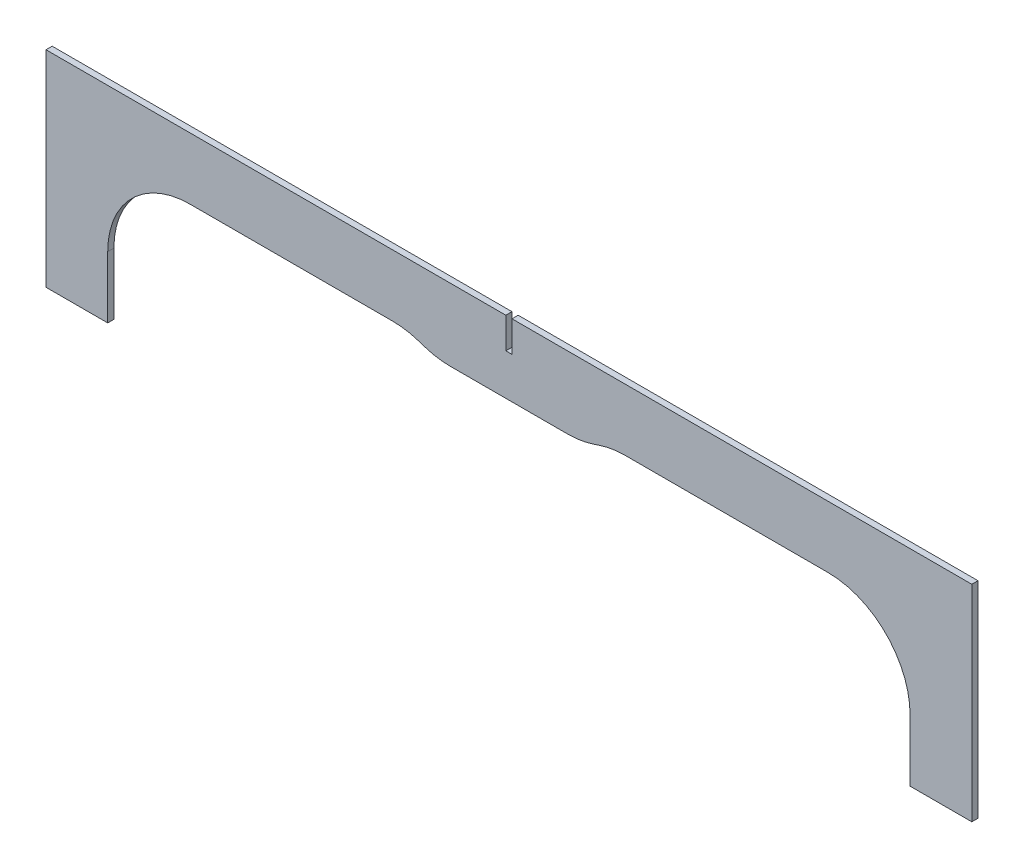
ISO-10303-21;
HEADER;
FILE_DESCRIPTION(('STEP AP214'),'2;1');
FILE_NAME('part.step','',(''),(''),'','','');
FILE_SCHEMA(('AUTOMOTIVE_DESIGN { 1 0 10303 214 1 1 1 1 }'));
ENDSEC;
DATA;
#1=APPLICATION_CONTEXT('core data for automotive mechanical design processes');
#2=APPLICATION_PROTOCOL_DEFINITION('international standard','automotive_design',2000,#1);
#3=PRODUCT_CONTEXT('',#1,'mechanical');
#4=PRODUCT('Part','Part','',(#3));
#5=PRODUCT_RELATED_PRODUCT_CATEGORY('part','',(#4));
#6=PRODUCT_DEFINITION_FORMATION('','',#4);
#7=PRODUCT_DEFINITION_CONTEXT('part definition',#1,'design');
#8=PRODUCT_DEFINITION('design','',#6,#7);
#9=PRODUCT_DEFINITION_SHAPE('','',#8);
#10=(LENGTH_UNIT() NAMED_UNIT(*) SI_UNIT(.MILLI.,.METRE.));
#11=(NAMED_UNIT(*) PLANE_ANGLE_UNIT() SI_UNIT($,.RADIAN.));
#12=(NAMED_UNIT(*) SI_UNIT($,.STERADIAN.) SOLID_ANGLE_UNIT());
#13=UNCERTAINTY_MEASURE_WITH_UNIT(LENGTH_MEASURE(1.E-05),#10,'distance_accuracy_value','');
#14=(GEOMETRIC_REPRESENTATION_CONTEXT(3) GLOBAL_UNCERTAINTY_ASSIGNED_CONTEXT((#13)) GLOBAL_UNIT_ASSIGNED_CONTEXT((#10,
#11,#12)) REPRESENTATION_CONTEXT('',''));
#15=CARTESIAN_POINT('',(0.,0.,0.));
#16=DIRECTION('',(0.,0.,1.));
#17=DIRECTION('',(1.,0.,0.));
#18=AXIS2_PLACEMENT_3D('',#15,#16,#17);
#19=CARTESIAN_POINT('',(30.,0.,3.));
#20=DIRECTION('',(0.,1.,0.));
#21=DIRECTION('',(-1.,0.,0.));
#22=AXIS2_PLACEMENT_3D('',#19,#20,#21);
#23=PLANE('',#22);
#24=DIRECTION('',(1.,0.,0.));
#25=VECTOR('',#24,1.);
#26=CARTESIAN_POINT('',(30.,0.,0.));
#27=LINE('',#26,#25);
#28=CARTESIAN_POINT('',(0.,0.,0.));
#29=VERTEX_POINT('',#28);
#30=CARTESIAN_POINT('',(30.,0.,0.));
#31=VERTEX_POINT('',#30);
#32=EDGE_CURVE('E211',#29,#31,#27,.T.);
#33=ORIENTED_EDGE('',*,*,#32,.T.);
#34=DIRECTION('',(0.,0.,-1.));
#35=VECTOR('',#34,1.);
#36=CARTESIAN_POINT('',(30.,0.,3.));
#37=LINE('',#36,#35);
#38=CARTESIAN_POINT('',(30.,0.,3.));
#39=VERTEX_POINT('',#38);
#40=EDGE_CURVE('E192',#39,#31,#37,.T.);
#41=ORIENTED_EDGE('',*,*,#40,.F.);
#42=DIRECTION('',(1.,0.,0.));
#43=VECTOR('',#42,1.);
#44=CARTESIAN_POINT('',(30.,0.,3.));
#45=LINE('',#44,#43);
#46=CARTESIAN_POINT('',(0.,0.,3.));
#47=VERTEX_POINT('',#46);
#48=EDGE_CURVE('E198',#47,#39,#45,.T.);
#49=ORIENTED_EDGE('',*,*,#48,.F.);
#50=DIRECTION('',(0.,0.,-1.));
#51=VECTOR('',#50,1.);
#52=CARTESIAN_POINT('',(0.,0.,3.));
#53=LINE('',#52,#51);
#54=EDGE_CURVE('E310',#47,#29,#53,.T.);
#55=ORIENTED_EDGE('',*,*,#54,.T.);
#56=EDGE_LOOP('',(#33,#41,#49,#55));
#57=FACE_BOUND('',#56,.T.);
#58=ADVANCED_FACE('F37',(#57),#23,.F.);
#59=CARTESIAN_POINT('',(30.,70.,3.));
#60=DIRECTION('',(-1.,0.,0.));
#61=DIRECTION('',(0.,-1.,0.));
#62=AXIS2_PLACEMENT_3D('',#59,#60,#61);
#63=PLANE('',#62);
#64=DIRECTION('',(0.,1.,0.));
#65=VECTOR('',#64,1.);
#66=CARTESIAN_POINT('',(30.,70.,0.));
#67=LINE('',#66,#65);
#68=CARTESIAN_POINT('',(30.,30.,0.));
#69=VERTEX_POINT('',#68);
#70=EDGE_CURVE('E269',#31,#69,#67,.T.);
#71=ORIENTED_EDGE('',*,*,#70,.T.);
#72=DIRECTION('',(0.,0.,-1.));
#73=VECTOR('',#72,1.);
#74=CARTESIAN_POINT('',(30.,30.,3.));
#75=LINE('',#74,#73);
#76=CARTESIAN_POINT('',(30.,30.,3.));
#77=VERTEX_POINT('',#76);
#78=EDGE_CURVE('E195',#69,#77,#75,.F.);
#79=ORIENTED_EDGE('',*,*,#78,.T.);
#80=DIRECTION('',(0.,1.,0.));
#81=VECTOR('',#80,1.);
#82=CARTESIAN_POINT('',(30.,70.,3.));
#83=LINE('',#82,#81);
#84=EDGE_CURVE('E187',#39,#77,#83,.T.);
#85=ORIENTED_EDGE('',*,*,#84,.F.);
#86=ORIENTED_EDGE('',*,*,#40,.T.);
#87=EDGE_LOOP('',(#71,#79,#85,#86));
#88=FACE_BOUND('',#87,.T.);
#89=ADVANCED_FACE('F190',(#88),#63,.F.);
#90=CARTESIAN_POINT('',(175.,70.,3.));
#91=DIRECTION('',(0.,1.,0.));
#92=DIRECTION('',(-1.,0.,0.));
#93=AXIS2_PLACEMENT_3D('',#90,#91,#92);
#94=PLANE('',#93);
#95=DIRECTION('',(1.,0.,0.));
#96=VECTOR('',#95,1.);
#97=CARTESIAN_POINT('',(175.,70.,0.));
#98=LINE('',#97,#96);
#99=CARTESIAN_POINT('',(70.,70.,0.));
#100=VERTEX_POINT('',#99);
#101=CARTESIAN_POINT('',(168.508893593265,70.,0.));
#102=VERTEX_POINT('',#101);
#103=EDGE_CURVE('E271',#100,#102,#98,.T.);
#104=ORIENTED_EDGE('',*,*,#103,.T.);
#105=DIRECTION('',(0.,0.,-1.));
#106=VECTOR('',#105,1.);
#107=CARTESIAN_POINT('',(168.508893593265,70.,3.));
#108=LINE('',#107,#106);
#109=CARTESIAN_POINT('',(168.508893593265,70.,3.));
#110=VERTEX_POINT('',#109);
#111=EDGE_CURVE('E240',#102,#110,#108,.F.);
#112=ORIENTED_EDGE('',*,*,#111,.T.);
#113=DIRECTION('',(1.,0.,0.));
#114=VECTOR('',#113,1.);
#115=CARTESIAN_POINT('',(175.,70.,3.));
#116=LINE('',#115,#114);
#117=CARTESIAN_POINT('',(70.,70.,3.));
#118=VERTEX_POINT('',#117);
#119=EDGE_CURVE('E197',#118,#110,#116,.T.);
#120=ORIENTED_EDGE('',*,*,#119,.F.);
#121=DIRECTION('',(0.,0.,-1.));
#122=VECTOR('',#121,1.);
#123=CARTESIAN_POINT('',(70.,70.,0.));
#124=LINE('',#123,#122);
#125=EDGE_CURVE('E237',#118,#100,#124,.T.);
#126=ORIENTED_EDGE('',*,*,#125,.T.);
#127=EDGE_LOOP('',(#104,#112,#120,#126));
#128=FACE_BOUND('',#127,.T.);
#129=ADVANCED_FACE('F279',(#128),#94,.F.);
#130=CARTESIAN_POINT('',(190.,65.,3.));
#131=DIRECTION('',(0.316227766016839,0.948683298050514,0.));
#132=DIRECTION('',(-0.948683298050514,0.316227766016839,0.));
#133=AXIS2_PLACEMENT_3D('',#130,#131,#132);
#134=PLANE('',#133);
#135=DIRECTION('',(0.948683298050513,-0.316227766016839,0.));
#136=VECTOR('',#135,1.);
#137=CARTESIAN_POINT('',(190.,65.,0.));
#138=LINE('',#137,#136);
#139=CARTESIAN_POINT('',(181.158004233938,67.9473319220205,0.));
#140=VERTEX_POINT('',#139);
#141=CARTESIAN_POINT('',(183.841995766062,67.0526680779794,0.));
#142=VERTEX_POINT('',#141);
#143=EDGE_CURVE('E313',#140,#142,#138,.T.);
#144=ORIENTED_EDGE('',*,*,#143,.T.);
#145=DIRECTION('',(0.,0.,-1.));
#146=VECTOR('',#145,1.);
#147=CARTESIAN_POINT('',(183.841995766062,67.0526680779794,3.));
#148=LINE('',#147,#146);
#149=CARTESIAN_POINT('',(183.841995766062,67.0526680779794,3.));
#150=VERTEX_POINT('',#149);
#151=EDGE_CURVE('E231',#142,#150,#148,.F.);
#152=ORIENTED_EDGE('',*,*,#151,.T.);
#153=DIRECTION('',(0.948683298050513,-0.316227766016839,0.));
#154=VECTOR('',#153,1.);
#155=CARTESIAN_POINT('',(190.,65.,3.));
#156=LINE('',#155,#154);
#157=CARTESIAN_POINT('',(181.158004233938,67.9473319220205,3.));
#158=VERTEX_POINT('',#157);
#159=EDGE_CURVE('E281',#158,#150,#156,.T.);
#160=ORIENTED_EDGE('',*,*,#159,.F.);
#161=DIRECTION('',(0.,0.,-1.));
#162=VECTOR('',#161,1.);
#163=CARTESIAN_POINT('',(181.158004233938,67.9473319220205,0.));
#164=LINE('',#163,#162);
#165=EDGE_CURVE('E228',#158,#140,#164,.T.);
#166=ORIENTED_EDGE('',*,*,#165,.T.);
#167=EDGE_LOOP('',(#144,#152,#160,#166));
#168=FACE_BOUND('',#167,.T.);
#169=ADVANCED_FACE('F440',(#168),#134,.F.);
#170=CARTESIAN_POINT('',(260.,65.,3.));
#171=DIRECTION('',(0.,1.,0.));
#172=DIRECTION('',(-1.,0.,0.));
#173=AXIS2_PLACEMENT_3D('',#170,#171,#172);
#174=PLANE('',#173);
#175=DIRECTION('',(1.,0.,0.));
#176=VECTOR('',#175,1.);
#177=CARTESIAN_POINT('',(260.,65.,3.));
#178=LINE('',#177,#176);
#179=CARTESIAN_POINT('',(196.491106406735,65.,3.));
#180=VERTEX_POINT('',#179);
#181=CARTESIAN_POINT('',(253.508893593265,65.,3.));
#182=VERTEX_POINT('',#181);
#183=EDGE_CURVE('E283',#180,#182,#178,.T.);
#184=ORIENTED_EDGE('',*,*,#183,.F.);
#185=DIRECTION('',(0.,0.,-1.));
#186=VECTOR('',#185,1.);
#187=CARTESIAN_POINT('',(196.491106406735,65.,3.));
#188=LINE('',#187,#186);
#189=CARTESIAN_POINT('',(196.491106406735,65.,0.));
#190=VERTEX_POINT('',#189);
#191=EDGE_CURVE('E215',#180,#190,#188,.T.);
#192=ORIENTED_EDGE('',*,*,#191,.T.);
#193=DIRECTION('',(1.,0.,0.));
#194=VECTOR('',#193,1.);
#195=CARTESIAN_POINT('',(260.,65.,0.));
#196=LINE('',#195,#194);
#197=CARTESIAN_POINT('',(253.508893593265,65.,0.));
#198=VERTEX_POINT('',#197);
#199=EDGE_CURVE('E316',#190,#198,#196,.T.);
#200=ORIENTED_EDGE('',*,*,#199,.T.);
#201=DIRECTION('',(0.,0.,-1.));
#202=VECTOR('',#201,1.);
#203=CARTESIAN_POINT('',(253.508893593265,65.,3.));
#204=LINE('',#203,#202);
#205=EDGE_CURVE('E212',#198,#182,#204,.F.);
#206=ORIENTED_EDGE('',*,*,#205,.T.);
#207=EDGE_LOOP('',(#184,#192,#200,#206));
#208=FACE_BOUND('',#207,.T.);
#209=ADVANCED_FACE('F434',(#208),#174,.F.);
#210=CARTESIAN_POINT('',(275.,70.,3.));
#211=DIRECTION('',(-0.316227766016835,0.948683298050515,0.));
#212=DIRECTION('',(-0.948683298050515,-0.316227766016835,0.));
#213=AXIS2_PLACEMENT_3D('',#210,#211,#212);
#214=PLANE('',#213);
#215=DIRECTION('',(0.948683298050515,0.316227766016835,0.));
#216=VECTOR('',#215,1.);
#217=CARTESIAN_POINT('',(275.,70.,3.));
#218=LINE('',#217,#216);
#219=CARTESIAN_POINT('',(266.158004233938,67.0526680779794,3.));
#220=VERTEX_POINT('',#219);
#221=CARTESIAN_POINT('',(268.841995766062,67.9473319220206,3.));
#222=VERTEX_POINT('',#221);
#223=EDGE_CURVE('E288',#220,#222,#218,.T.);
#224=ORIENTED_EDGE('',*,*,#223,.F.);
#225=DIRECTION('',(0.,0.,-1.));
#226=VECTOR('',#225,1.);
#227=CARTESIAN_POINT('',(266.158004233938,67.0526680779794,3.));
#228=LINE('',#227,#226);
#229=CARTESIAN_POINT('',(266.158004233938,67.0526680779794,0.));
#230=VERTEX_POINT('',#229);
#231=EDGE_CURVE('E244',#220,#230,#228,.T.);
#232=ORIENTED_EDGE('',*,*,#231,.T.);
#233=DIRECTION('',(0.948683298050515,0.316227766016835,0.));
#234=VECTOR('',#233,1.);
#235=CARTESIAN_POINT('',(275.,70.,0.));
#236=LINE('',#235,#234);
#237=CARTESIAN_POINT('',(268.841995766062,67.9473319220206,0.));
#238=VERTEX_POINT('',#237);
#239=EDGE_CURVE('E319',#230,#238,#236,.T.);
#240=ORIENTED_EDGE('',*,*,#239,.T.);
#241=DIRECTION('',(0.,0.,-1.));
#242=VECTOR('',#241,1.);
#243=CARTESIAN_POINT('',(268.841995766062,67.9473319220206,3.));
#244=LINE('',#243,#242);
#245=EDGE_CURVE('E242',#238,#222,#244,.F.);
#246=ORIENTED_EDGE('',*,*,#245,.T.);
#247=EDGE_LOOP('',(#224,#232,#240,#246));
#248=FACE_BOUND('',#247,.T.);
#249=ADVANCED_FACE('F430',(#248),#214,.F.);
#250=CARTESIAN_POINT('',(420.,70.,3.));
#251=DIRECTION('',(0.,1.,0.));
#252=DIRECTION('',(-1.,0.,0.));
#253=AXIS2_PLACEMENT_3D('',#250,#251,#252);
#254=PLANE('',#253);
#255=DIRECTION('',(1.,0.,0.));
#256=VECTOR('',#255,1.);
#257=CARTESIAN_POINT('',(420.,70.,3.));
#258=LINE('',#257,#256);
#259=CARTESIAN_POINT('',(281.491106406735,70.,3.));
#260=VERTEX_POINT('',#259);
#261=CARTESIAN_POINT('',(380.,70.,3.));
#262=VERTEX_POINT('',#261);
#263=EDGE_CURVE('E291',#260,#262,#258,.T.);
#264=ORIENTED_EDGE('',*,*,#263,.F.);
#265=DIRECTION('',(0.,0.,-1.));
#266=VECTOR('',#265,1.);
#267=CARTESIAN_POINT('',(281.491106406735,70.,0.));
#268=LINE('',#267,#266);
#269=CARTESIAN_POINT('',(281.491106406735,70.,0.));
#270=VERTEX_POINT('',#269);
#271=EDGE_CURVE('E248',#260,#270,#268,.T.);
#272=ORIENTED_EDGE('',*,*,#271,.T.);
#273=DIRECTION('',(1.,0.,0.));
#274=VECTOR('',#273,1.);
#275=CARTESIAN_POINT('',(420.,70.,0.));
#276=LINE('',#275,#274);
#277=CARTESIAN_POINT('',(380.,70.,0.));
#278=VERTEX_POINT('',#277);
#279=EDGE_CURVE('E322',#270,#278,#276,.T.);
#280=ORIENTED_EDGE('',*,*,#279,.T.);
#281=DIRECTION('',(0.,0.,-1.));
#282=VECTOR('',#281,1.);
#283=CARTESIAN_POINT('',(380.,70.,3.));
#284=LINE('',#283,#282);
#285=EDGE_CURVE('E60',#278,#262,#284,.F.);
#286=ORIENTED_EDGE('',*,*,#285,.T.);
#287=EDGE_LOOP('',(#264,#272,#280,#286));
#288=FACE_BOUND('',#287,.T.);
#289=ADVANCED_FACE('F390',(#288),#254,.F.);
#290=CARTESIAN_POINT('',(420.,0.,3.));
#291=DIRECTION('',(1.,0.,0.));
#292=DIRECTION('',(0.,0.,-1.));
#293=AXIS2_PLACEMENT_3D('',#290,#291,#292);
#294=PLANE('',#293);
#295=DIRECTION('',(0.,-1.,0.));
#296=VECTOR('',#295,1.);
#297=CARTESIAN_POINT('',(420.,0.,3.));
#298=LINE('',#297,#296);
#299=CARTESIAN_POINT('',(420.,30.,3.));
#300=VERTEX_POINT('',#299);
#301=CARTESIAN_POINT('',(420.,0.,3.));
#302=VERTEX_POINT('',#301);
#303=EDGE_CURVE('E293',#300,#302,#298,.T.);
#304=ORIENTED_EDGE('',*,*,#303,.F.);
#305=DIRECTION('',(0.,0.,-1.));
#306=VECTOR('',#305,1.);
#307=CARTESIAN_POINT('',(420.,30.,0.));
#308=LINE('',#307,#306);
#309=CARTESIAN_POINT('',(420.,30.,0.));
#310=VERTEX_POINT('',#309);
#311=EDGE_CURVE('E251',#300,#310,#308,.T.);
#312=ORIENTED_EDGE('',*,*,#311,.T.);
#313=DIRECTION('',(0.,-1.,0.));
#314=VECTOR('',#313,1.);
#315=CARTESIAN_POINT('',(420.,0.,0.));
#316=LINE('',#315,#314);
#317=CARTESIAN_POINT('',(420.,0.,0.));
#318=VERTEX_POINT('',#317);
#319=EDGE_CURVE('E324',#310,#318,#316,.T.);
#320=ORIENTED_EDGE('',*,*,#319,.T.);
#321=DIRECTION('',(0.,0.,-1.));
#322=VECTOR('',#321,1.);
#323=CARTESIAN_POINT('',(420.,0.,3.));
#324=LINE('',#323,#322);
#325=EDGE_CURVE('E213',#302,#318,#324,.T.);
#326=ORIENTED_EDGE('',*,*,#325,.F.);
#327=EDGE_LOOP('',(#304,#312,#320,#326));
#328=FACE_BOUND('',#327,.T.);
#329=ADVANCED_FACE('F386',(#328),#294,.F.);
#330=CARTESIAN_POINT('',(450.,0.,3.));
#331=DIRECTION('',(0.,1.,0.));
#332=DIRECTION('',(-1.,0.,0.));
#333=AXIS2_PLACEMENT_3D('',#330,#331,#332);
#334=PLANE('',#333);
#335=DIRECTION('',(1.,0.,0.));
#336=VECTOR('',#335,1.);
#337=CARTESIAN_POINT('',(450.,0.,0.));
#338=LINE('',#337,#336);
#339=CARTESIAN_POINT('',(450.,0.,0.));
#340=VERTEX_POINT('',#339);
#341=EDGE_CURVE('E326',#318,#340,#338,.T.);
#342=ORIENTED_EDGE('',*,*,#341,.T.);
#343=DIRECTION('',(0.,0.,-1.));
#344=VECTOR('',#343,1.);
#345=CARTESIAN_POINT('',(450.,0.,3.));
#346=LINE('',#345,#344);
#347=CARTESIAN_POINT('',(450.,0.,3.));
#348=VERTEX_POINT('',#347);
#349=EDGE_CURVE('E218',#348,#340,#346,.T.);
#350=ORIENTED_EDGE('',*,*,#349,.F.);
#351=DIRECTION('',(1.,0.,0.));
#352=VECTOR('',#351,1.);
#353=CARTESIAN_POINT('',(450.,0.,3.));
#354=LINE('',#353,#352);
#355=EDGE_CURVE('E295',#302,#348,#354,.T.);
#356=ORIENTED_EDGE('',*,*,#355,.F.);
#357=ORIENTED_EDGE('',*,*,#325,.T.);
#358=EDGE_LOOP('',(#342,#350,#356,#357));
#359=FACE_BOUND('',#358,.T.);
#360=ADVANCED_FACE('F384',(#359),#334,.F.);
#361=CARTESIAN_POINT('',(450.,100.,3.));
#362=DIRECTION('',(-1.,0.,0.));
#363=DIRECTION('',(0.,0.,1.));
#364=AXIS2_PLACEMENT_3D('',#361,#362,#363);
#365=PLANE('',#364);
#366=DIRECTION('',(0.,1.,0.));
#367=VECTOR('',#366,1.);
#368=CARTESIAN_POINT('',(450.,100.,0.));
#369=LINE('',#368,#367);
#370=CARTESIAN_POINT('',(450.,100.,0.));
#371=VERTEX_POINT('',#370);
#372=EDGE_CURVE('E328',#340,#371,#369,.T.);
#373=ORIENTED_EDGE('',*,*,#372,.T.);
#374=DIRECTION('',(0.,0.,-1.));
#375=VECTOR('',#374,1.);
#376=CARTESIAN_POINT('',(450.,100.,3.));
#377=LINE('',#376,#375);
#378=CARTESIAN_POINT('',(450.,100.,3.));
#379=VERTEX_POINT('',#378);
#380=EDGE_CURVE('E357',#379,#371,#377,.T.);
#381=ORIENTED_EDGE('',*,*,#380,.F.);
#382=DIRECTION('',(0.,1.,0.));
#383=VECTOR('',#382,1.);
#384=CARTESIAN_POINT('',(450.,100.,3.));
#385=LINE('',#384,#383);
#386=EDGE_CURVE('E297',#348,#379,#385,.T.);
#387=ORIENTED_EDGE('',*,*,#386,.F.);
#388=ORIENTED_EDGE('',*,*,#349,.T.);
#389=EDGE_LOOP('',(#373,#381,#387,#388));
#390=FACE_BOUND('',#389,.T.);
#391=ADVANCED_FACE('F364',(#390),#365,.F.);
#392=CARTESIAN_POINT('',(226.5,100.,3.));
#393=DIRECTION('',(0.,-1.,0.));
#394=DIRECTION('',(0.,0.,-1.));
#395=AXIS2_PLACEMENT_3D('',#392,#393,#394);
#396=PLANE('',#395);
#397=DIRECTION('',(-1.,0.,0.));
#398=VECTOR('',#397,1.);
#399=CARTESIAN_POINT('',(226.5,100.,0.));
#400=LINE('',#399,#398);
#401=CARTESIAN_POINT('',(226.5,100.,0.));
#402=VERTEX_POINT('',#401);
#403=EDGE_CURVE('E330',#371,#402,#400,.T.);
#404=ORIENTED_EDGE('',*,*,#403,.T.);
#405=DIRECTION('',(0.,0.,-1.));
#406=VECTOR('',#405,1.);
#407=CARTESIAN_POINT('',(226.5,100.,3.));
#408=LINE('',#407,#406);
#409=CARTESIAN_POINT('',(226.5,100.,3.));
#410=VERTEX_POINT('',#409);
#411=EDGE_CURVE('E354',#410,#402,#408,.T.);
#412=ORIENTED_EDGE('',*,*,#411,.F.);
#413=DIRECTION('',(-1.,0.,0.));
#414=VECTOR('',#413,1.);
#415=CARTESIAN_POINT('',(226.5,100.,3.));
#416=LINE('',#415,#414);
#417=EDGE_CURVE('E299',#379,#410,#416,.T.);
#418=ORIENTED_EDGE('',*,*,#417,.F.);
#419=ORIENTED_EDGE('',*,*,#380,.T.);
#420=EDGE_LOOP('',(#404,#412,#418,#419));
#421=FACE_BOUND('',#420,.T.);
#422=ADVANCED_FACE('F375',(#421),#396,.F.);
#423=CARTESIAN_POINT('',(226.5,85.,3.));
#424=DIRECTION('',(1.,0.,0.));
#425=DIRECTION('',(0.,0.,-1.));
#426=AXIS2_PLACEMENT_3D('',#423,#424,#425);
#427=PLANE('',#426);
#428=DIRECTION('',(0.,-1.,0.));
#429=VECTOR('',#428,1.);
#430=CARTESIAN_POINT('',(226.5,85.,0.));
#431=LINE('',#430,#429);
#432=CARTESIAN_POINT('',(226.5,85.,0.));
#433=VERTEX_POINT('',#432);
#434=EDGE_CURVE('E332',#402,#433,#431,.T.);
#435=ORIENTED_EDGE('',*,*,#434,.T.);
#436=DIRECTION('',(0.,0.,-1.));
#437=VECTOR('',#436,1.);
#438=CARTESIAN_POINT('',(226.5,85.,3.));
#439=LINE('',#438,#437);
#440=CARTESIAN_POINT('',(226.5,85.,3.));
#441=VERTEX_POINT('',#440);
#442=EDGE_CURVE('E351',#441,#433,#439,.T.);
#443=ORIENTED_EDGE('',*,*,#442,.F.);
#444=DIRECTION('',(0.,-1.,0.));
#445=VECTOR('',#444,1.);
#446=CARTESIAN_POINT('',(226.5,85.,3.));
#447=LINE('',#446,#445);
#448=EDGE_CURVE('E301',#410,#441,#447,.T.);
#449=ORIENTED_EDGE('',*,*,#448,.F.);
#450=ORIENTED_EDGE('',*,*,#411,.T.);
#451=EDGE_LOOP('',(#435,#443,#449,#450));
#452=FACE_BOUND('',#451,.T.);
#453=ADVANCED_FACE('F379',(#452),#427,.F.);
#454=CARTESIAN_POINT('',(223.5,85.,3.));
#455=DIRECTION('',(0.,-1.,0.));
#456=DIRECTION('',(0.,0.,-1.));
#457=AXIS2_PLACEMENT_3D('',#454,#455,#456);
#458=PLANE('',#457);
#459=DIRECTION('',(-1.,0.,0.));
#460=VECTOR('',#459,1.);
#461=CARTESIAN_POINT('',(223.5,85.,0.));
#462=LINE('',#461,#460);
#463=CARTESIAN_POINT('',(223.5,85.,0.));
#464=VERTEX_POINT('',#463);
#465=EDGE_CURVE('E334',#433,#464,#462,.T.);
#466=ORIENTED_EDGE('',*,*,#465,.T.);
#467=DIRECTION('',(0.,0.,-1.));
#468=VECTOR('',#467,1.);
#469=CARTESIAN_POINT('',(223.5,85.,3.));
#470=LINE('',#469,#468);
#471=CARTESIAN_POINT('',(223.5,85.,3.));
#472=VERTEX_POINT('',#471);
#473=EDGE_CURVE('E348',#472,#464,#470,.T.);
#474=ORIENTED_EDGE('',*,*,#473,.F.);
#475=DIRECTION('',(-1.,0.,0.));
#476=VECTOR('',#475,1.);
#477=CARTESIAN_POINT('',(223.5,85.,3.));
#478=LINE('',#477,#476);
#479=EDGE_CURVE('E303',#441,#472,#478,.T.);
#480=ORIENTED_EDGE('',*,*,#479,.F.);
#481=ORIENTED_EDGE('',*,*,#442,.T.);
#482=EDGE_LOOP('',(#466,#474,#480,#481));
#483=FACE_BOUND('',#482,.T.);
#484=ADVANCED_FACE('F465',(#483),#458,.F.);
#485=CARTESIAN_POINT('',(223.5,100.,3.));
#486=DIRECTION('',(-1.,0.,0.));
#487=DIRECTION('',(0.,0.,1.));
#488=AXIS2_PLACEMENT_3D('',#485,#486,#487);
#489=PLANE('',#488);
#490=DIRECTION('',(0.,1.,0.));
#491=VECTOR('',#490,1.);
#492=CARTESIAN_POINT('',(223.5,100.,0.));
#493=LINE('',#492,#491);
#494=CARTESIAN_POINT('',(223.5,100.,0.));
#495=VERTEX_POINT('',#494);
#496=EDGE_CURVE('E336',#464,#495,#493,.T.);
#497=ORIENTED_EDGE('',*,*,#496,.T.);
#498=DIRECTION('',(0.,0.,-1.));
#499=VECTOR('',#498,1.);
#500=CARTESIAN_POINT('',(223.5,100.,3.));
#501=LINE('',#500,#499);
#502=CARTESIAN_POINT('',(223.5,100.,3.));
#503=VERTEX_POINT('',#502);
#504=EDGE_CURVE('E345',#503,#495,#501,.T.);
#505=ORIENTED_EDGE('',*,*,#504,.F.);
#506=DIRECTION('',(0.,1.,0.));
#507=VECTOR('',#506,1.);
#508=CARTESIAN_POINT('',(223.5,100.,3.));
#509=LINE('',#508,#507);
#510=EDGE_CURVE('E305',#472,#503,#509,.T.);
#511=ORIENTED_EDGE('',*,*,#510,.F.);
#512=ORIENTED_EDGE('',*,*,#473,.T.);
#513=EDGE_LOOP('',(#497,#505,#511,#512));
#514=FACE_BOUND('',#513,.T.);
#515=ADVANCED_FACE('F468',(#514),#489,.F.);
#516=CARTESIAN_POINT('',(0.,100.,3.));
#517=DIRECTION('',(0.,-1.,0.));
#518=DIRECTION('',(0.,0.,-1.));
#519=AXIS2_PLACEMENT_3D('',#516,#517,#518);
#520=PLANE('',#519);
#521=DIRECTION('',(-1.,0.,0.));
#522=VECTOR('',#521,1.);
#523=CARTESIAN_POINT('',(0.,100.,0.));
#524=LINE('',#523,#522);
#525=CARTESIAN_POINT('',(0.,100.,0.));
#526=VERTEX_POINT('',#525);
#527=EDGE_CURVE('E338',#495,#526,#524,.T.);
#528=ORIENTED_EDGE('',*,*,#527,.T.);
#529=DIRECTION('',(0.,0.,-1.));
#530=VECTOR('',#529,1.);
#531=CARTESIAN_POINT('',(0.,100.,3.));
#532=LINE('',#531,#530);
#533=CARTESIAN_POINT('',(0.,100.,3.));
#534=VERTEX_POINT('',#533);
#535=EDGE_CURVE('E342',#534,#526,#532,.T.);
#536=ORIENTED_EDGE('',*,*,#535,.F.);
#537=DIRECTION('',(-1.,0.,0.));
#538=VECTOR('',#537,1.);
#539=CARTESIAN_POINT('',(0.,100.,3.));
#540=LINE('',#539,#538);
#541=EDGE_CURVE('E307',#503,#534,#540,.T.);
#542=ORIENTED_EDGE('',*,*,#541,.F.);
#543=ORIENTED_EDGE('',*,*,#504,.T.);
#544=EDGE_LOOP('',(#528,#536,#542,#543));
#545=FACE_BOUND('',#544,.T.);
#546=ADVANCED_FACE('F472',(#545),#520,.F.);
#547=CARTESIAN_POINT('',(0.,0.,3.));
#548=DIRECTION('',(1.,0.,0.));
#549=DIRECTION('',(0.,0.,-1.));
#550=AXIS2_PLACEMENT_3D('',#547,#548,#549);
#551=PLANE('',#550);
#552=DIRECTION('',(0.,-1.,0.));
#553=VECTOR('',#552,1.);
#554=CARTESIAN_POINT('',(0.,0.,0.));
#555=LINE('',#554,#553);
#556=EDGE_CURVE('E208',#526,#29,#555,.T.);
#557=ORIENTED_EDGE('',*,*,#556,.T.);
#558=ORIENTED_EDGE('',*,*,#54,.F.);
#559=DIRECTION('',(0.,-1.,0.));
#560=VECTOR('',#559,1.);
#561=CARTESIAN_POINT('',(0.,0.,3.));
#562=LINE('',#561,#560);
#563=EDGE_CURVE('E204',#534,#47,#562,.T.);
#564=ORIENTED_EDGE('',*,*,#563,.F.);
#565=ORIENTED_EDGE('',*,*,#535,.T.);
#566=EDGE_LOOP('',(#557,#558,#564,#565));
#567=FACE_BOUND('',#566,.T.);
#568=ADVANCED_FACE('F476',(#567),#551,.F.);
#569=CARTESIAN_POINT('',(0.,0.,3.));
#570=DIRECTION('',(0.,0.,-1.));
#571=DIRECTION('',(-1.,0.,0.));
#572=AXIS2_PLACEMENT_3D('',#569,#570,#571);
#573=PLANE('',#572);
#574=ORIENTED_EDGE('',*,*,#159,.T.);
#575=CARTESIAN_POINT('',(196.491106406735,105.,3.));
#576=DIRECTION('',(0.,0.,-1.));
#577=DIRECTION('',(-1.,0.,0.));
#578=AXIS2_PLACEMENT_3D('',#575,#576,#577);
#579=CIRCLE('',#578,40.);
#580=EDGE_CURVE('E235',#150,#180,#579,.F.);
#581=ORIENTED_EDGE('',*,*,#580,.T.);
#582=ORIENTED_EDGE('',*,*,#183,.T.);
#583=CARTESIAN_POINT('',(253.508893593265,105.,3.));
#584=DIRECTION('',(0.,0.,-1.));
#585=DIRECTION('',(-1.,0.,0.));
#586=AXIS2_PLACEMENT_3D('',#583,#584,#585);
#587=CIRCLE('',#586,40.);
#588=EDGE_CURVE('E233',#182,#220,#587,.F.);
#589=ORIENTED_EDGE('',*,*,#588,.T.);
#590=ORIENTED_EDGE('',*,*,#223,.T.);
#591=CARTESIAN_POINT('',(281.491106406735,30.,3.));
#592=DIRECTION('',(0.,0.,-1.));
#593=DIRECTION('',(-1.,0.,0.));
#594=AXIS2_PLACEMENT_3D('',#591,#592,#593);
#595=CIRCLE('',#594,40.);
#596=EDGE_CURVE('E261',#222,#260,#595,.T.);
#597=ORIENTED_EDGE('',*,*,#596,.T.);
#598=ORIENTED_EDGE('',*,*,#263,.T.);
#599=CARTESIAN_POINT('',(380.,30.,3.));
#600=DIRECTION('',(0.,0.,-1.));
#601=DIRECTION('',(-1.,0.,0.));
#602=AXIS2_PLACEMENT_3D('',#599,#600,#601);
#603=CIRCLE('',#602,40.);
#604=EDGE_CURVE('E52',#262,#300,#603,.T.);
#605=ORIENTED_EDGE('',*,*,#604,.T.);
#606=ORIENTED_EDGE('',*,*,#303,.T.);
#607=ORIENTED_EDGE('',*,*,#355,.T.);
#608=ORIENTED_EDGE('',*,*,#386,.T.);
#609=ORIENTED_EDGE('',*,*,#417,.T.);
#610=ORIENTED_EDGE('',*,*,#448,.T.);
#611=ORIENTED_EDGE('',*,*,#479,.T.);
#612=ORIENTED_EDGE('',*,*,#510,.T.);
#613=ORIENTED_EDGE('',*,*,#541,.T.);
#614=ORIENTED_EDGE('',*,*,#563,.T.);
#615=ORIENTED_EDGE('',*,*,#48,.T.);
#616=ORIENTED_EDGE('',*,*,#84,.T.);
#617=CARTESIAN_POINT('',(70.,30.,3.));
#618=DIRECTION('',(0.,0.,-1.));
#619=DIRECTION('',(-1.,0.,0.));
#620=AXIS2_PLACEMENT_3D('',#617,#618,#619);
#621=CIRCLE('',#620,40.);
#622=EDGE_CURVE('E11',#77,#118,#621,.T.);
#623=ORIENTED_EDGE('',*,*,#622,.T.);
#624=ORIENTED_EDGE('',*,*,#119,.T.);
#625=CARTESIAN_POINT('',(168.508893593265,30.,3.));
#626=DIRECTION('',(0.,0.,-1.));
#627=DIRECTION('',(-1.,0.,0.));
#628=AXIS2_PLACEMENT_3D('',#625,#626,#627);
#629=CIRCLE('',#628,40.);
#630=EDGE_CURVE('E257',#110,#158,#629,.T.);
#631=ORIENTED_EDGE('',*,*,#630,.T.);
#632=EDGE_LOOP('',(#574,#581,#582,#589,#590,#597,#598,#605,#606,#607,#608,#609,#610,#611,#612,
#613,#614,#615,#616,#623,#624,#631));
#633=FACE_BOUND('',#632,.T.);
#634=ADVANCED_FACE('F202',(#633),#573,.F.);
#635=CARTESIAN_POINT('',(0.,0.,0.));
#636=DIRECTION('',(0.,0.,-1.));
#637=DIRECTION('',(-1.,0.,0.));
#638=AXIS2_PLACEMENT_3D('',#635,#636,#637);
#639=PLANE('',#638);
#640=ORIENTED_EDGE('',*,*,#199,.F.);
#641=CARTESIAN_POINT('',(196.491106406735,105.,0.));
#642=DIRECTION('',(0.,0.,-1.));
#643=DIRECTION('',(-1.,0.,0.));
#644=AXIS2_PLACEMENT_3D('',#641,#642,#643);
#645=CIRCLE('',#644,40.);
#646=EDGE_CURVE('E226',#190,#142,#645,.T.);
#647=ORIENTED_EDGE('',*,*,#646,.T.);
#648=ORIENTED_EDGE('',*,*,#143,.F.);
#649=CARTESIAN_POINT('',(168.508893593265,30.,0.));
#650=DIRECTION('',(0.,0.,-1.));
#651=DIRECTION('',(-1.,0.,0.));
#652=AXIS2_PLACEMENT_3D('',#649,#650,#651);
#653=CIRCLE('',#652,40.);
#654=EDGE_CURVE('E255',#140,#102,#653,.F.);
#655=ORIENTED_EDGE('',*,*,#654,.T.);
#656=ORIENTED_EDGE('',*,*,#103,.F.);
#657=CARTESIAN_POINT('',(70.,30.,0.));
#658=DIRECTION('',(0.,0.,-1.));
#659=DIRECTION('',(-1.,0.,0.));
#660=AXIS2_PLACEMENT_3D('',#657,#658,#659);
#661=CIRCLE('',#660,40.);
#662=EDGE_CURVE('E45',#100,#69,#661,.F.);
#663=ORIENTED_EDGE('',*,*,#662,.T.);
#664=ORIENTED_EDGE('',*,*,#70,.F.);
#665=ORIENTED_EDGE('',*,*,#32,.F.);
#666=ORIENTED_EDGE('',*,*,#556,.F.);
#667=ORIENTED_EDGE('',*,*,#527,.F.);
#668=ORIENTED_EDGE('',*,*,#496,.F.);
#669=ORIENTED_EDGE('',*,*,#465,.F.);
#670=ORIENTED_EDGE('',*,*,#434,.F.);
#671=ORIENTED_EDGE('',*,*,#403,.F.);
#672=ORIENTED_EDGE('',*,*,#372,.F.);
#673=ORIENTED_EDGE('',*,*,#341,.F.);
#674=ORIENTED_EDGE('',*,*,#319,.F.);
#675=CARTESIAN_POINT('',(380.,30.,0.));
#676=DIRECTION('',(0.,0.,-1.));
#677=DIRECTION('',(-1.,0.,0.));
#678=AXIS2_PLACEMENT_3D('',#675,#676,#677);
#679=CIRCLE('',#678,40.);
#680=EDGE_CURVE('E263',#310,#278,#679,.F.);
#681=ORIENTED_EDGE('',*,*,#680,.T.);
#682=ORIENTED_EDGE('',*,*,#279,.F.);
#683=CARTESIAN_POINT('',(281.491106406735,30.,0.));
#684=DIRECTION('',(0.,0.,-1.));
#685=DIRECTION('',(-1.,0.,0.));
#686=AXIS2_PLACEMENT_3D('',#683,#684,#685);
#687=CIRCLE('',#686,40.);
#688=EDGE_CURVE('E259',#270,#238,#687,.F.);
#689=ORIENTED_EDGE('',*,*,#688,.T.);
#690=ORIENTED_EDGE('',*,*,#239,.F.);
#691=CARTESIAN_POINT('',(253.508893593265,105.,0.));
#692=DIRECTION('',(0.,0.,-1.));
#693=DIRECTION('',(-1.,0.,0.));
#694=AXIS2_PLACEMENT_3D('',#691,#692,#693);
#695=CIRCLE('',#694,40.);
#696=EDGE_CURVE('E224',#230,#198,#695,.T.);
#697=ORIENTED_EDGE('',*,*,#696,.T.);
#698=EDGE_LOOP('',(#640,#647,#648,#655,#656,#663,#664,#665,#666,#667,#668,#669,#670,#671,#672,
#673,#674,#681,#682,#689,#690,#697));
#699=FACE_BOUND('',#698,.T.);
#700=ADVANCED_FACE('F268',(#699),#639,.T.);
#701=CARTESIAN_POINT('',(196.491106406735,105.,3.));
#702=DIRECTION('',(0.,0.,-1.));
#703=DIRECTION('',(-1.,0.,0.));
#704=AXIS2_PLACEMENT_3D('',#701,#702,#703);
#705=CYLINDRICAL_SURFACE('',#704,40.);
#706=ORIENTED_EDGE('',*,*,#580,.F.);
#707=ORIENTED_EDGE('',*,*,#151,.F.);
#708=ORIENTED_EDGE('',*,*,#646,.F.);
#709=ORIENTED_EDGE('',*,*,#191,.F.);
#710=EDGE_LOOP('',(#706,#707,#708,#709));
#711=FACE_BOUND('',#710,.T.);
#712=ADVANCED_FACE('F411',(#711),#705,.T.);
#713=CARTESIAN_POINT('',(168.508893593265,30.,3.));
#714=DIRECTION('',(0.,0.,1.));
#715=DIRECTION('',(1.,0.,0.));
#716=AXIS2_PLACEMENT_3D('',#713,#714,#715);
#717=CYLINDRICAL_SURFACE('',#716,40.);
#718=ORIENTED_EDGE('',*,*,#630,.F.);
#719=ORIENTED_EDGE('',*,*,#111,.F.);
#720=ORIENTED_EDGE('',*,*,#654,.F.);
#721=ORIENTED_EDGE('',*,*,#165,.F.);
#722=EDGE_LOOP('',(#718,#719,#720,#721));
#723=FACE_BOUND('',#722,.T.);
#724=ADVANCED_FACE('F414',(#723),#717,.F.);
#725=CARTESIAN_POINT('',(253.508893593265,105.,3.));
#726=DIRECTION('',(0.,0.,-1.));
#727=DIRECTION('',(-1.,0.,0.));
#728=AXIS2_PLACEMENT_3D('',#725,#726,#727);
#729=CYLINDRICAL_SURFACE('',#728,40.);
#730=ORIENTED_EDGE('',*,*,#588,.F.);
#731=ORIENTED_EDGE('',*,*,#205,.F.);
#732=ORIENTED_EDGE('',*,*,#696,.F.);
#733=ORIENTED_EDGE('',*,*,#231,.F.);
#734=EDGE_LOOP('',(#730,#731,#732,#733));
#735=FACE_BOUND('',#734,.T.);
#736=ADVANCED_FACE('F399',(#735),#729,.T.);
#737=CARTESIAN_POINT('',(281.491106406735,30.,3.));
#738=DIRECTION('',(0.,0.,1.));
#739=DIRECTION('',(1.,0.,0.));
#740=AXIS2_PLACEMENT_3D('',#737,#738,#739);
#741=CYLINDRICAL_SURFACE('',#740,40.);
#742=ORIENTED_EDGE('',*,*,#596,.F.);
#743=ORIENTED_EDGE('',*,*,#245,.F.);
#744=ORIENTED_EDGE('',*,*,#688,.F.);
#745=ORIENTED_EDGE('',*,*,#271,.F.);
#746=EDGE_LOOP('',(#742,#743,#744,#745));
#747=FACE_BOUND('',#746,.T.);
#748=ADVANCED_FACE('F394',(#747),#741,.F.);
#749=CARTESIAN_POINT('',(380.,30.,3.));
#750=DIRECTION('',(0.,0.,1.));
#751=DIRECTION('',(1.,0.,0.));
#752=AXIS2_PLACEMENT_3D('',#749,#750,#751);
#753=CYLINDRICAL_SURFACE('',#752,40.);
#754=ORIENTED_EDGE('',*,*,#604,.F.);
#755=ORIENTED_EDGE('',*,*,#285,.F.);
#756=ORIENTED_EDGE('',*,*,#680,.F.);
#757=ORIENTED_EDGE('',*,*,#311,.F.);
#758=EDGE_LOOP('',(#754,#755,#756,#757));
#759=FACE_BOUND('',#758,.T.);
#760=ADVANCED_FACE('F392',(#759),#753,.F.);
#761=CARTESIAN_POINT('',(70.,30.,3.));
#762=DIRECTION('',(0.,0.,1.));
#763=DIRECTION('',(1.,0.,0.));
#764=AXIS2_PLACEMENT_3D('',#761,#762,#763);
#765=CYLINDRICAL_SURFACE('',#764,40.);
#766=ORIENTED_EDGE('',*,*,#622,.F.);
#767=ORIENTED_EDGE('',*,*,#78,.F.);
#768=ORIENTED_EDGE('',*,*,#662,.F.);
#769=ORIENTED_EDGE('',*,*,#125,.F.);
#770=EDGE_LOOP('',(#766,#767,#768,#769));
#771=FACE_BOUND('',#770,.T.);
#772=ADVANCED_FACE('F39',(#771),#765,.F.);
#773=CLOSED_SHELL('',(#58,#89,#129,#169,#209,#249,#289,#329,#360,#391,#422,#453,#484,#515,#546,
#568,#634,#700,#712,#724,#736,#748,#760,#772));
#774=MANIFOLD_SOLID_BREP('B2',#773);
#775=ADVANCED_BREP_SHAPE_REPRESENTATION('',(#18,#774),#14);
#776=SHAPE_DEFINITION_REPRESENTATION(#9,#775);
ENDSEC;
END-ISO-10303-21;
